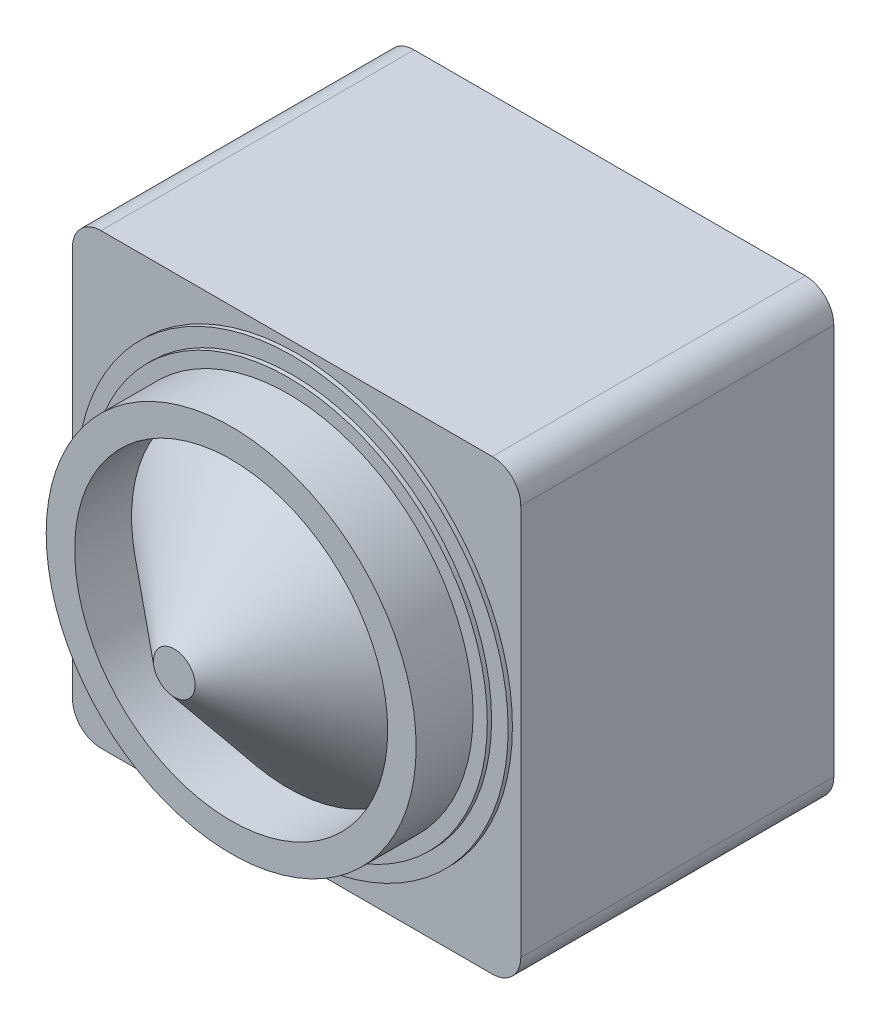
ISO-10303-21;
HEADER;
FILE_DESCRIPTION(('STEP AP214'),'2;1');
FILE_NAME('part.step','',(''),(''),'','','');
FILE_SCHEMA(('AUTOMOTIVE_DESIGN { 1 0 10303 214 1 1 1 1 }'));
ENDSEC;
DATA;
#1=APPLICATION_CONTEXT('core data for automotive mechanical design processes');
#2=APPLICATION_PROTOCOL_DEFINITION('international standard','automotive_design',2000,#1);
#3=PRODUCT_CONTEXT('',#1,'mechanical');
#4=PRODUCT('Part','Part','',(#3));
#5=PRODUCT_RELATED_PRODUCT_CATEGORY('part','',(#4));
#6=PRODUCT_DEFINITION_FORMATION('','',#4);
#7=PRODUCT_DEFINITION_CONTEXT('part definition',#1,'design');
#8=PRODUCT_DEFINITION('design','',#6,#7);
#9=PRODUCT_DEFINITION_SHAPE('','',#8);
#10=(LENGTH_UNIT() NAMED_UNIT(*) SI_UNIT(.MILLI.,.METRE.));
#11=(NAMED_UNIT(*) PLANE_ANGLE_UNIT() SI_UNIT($,.RADIAN.));
#12=(NAMED_UNIT(*) SI_UNIT($,.STERADIAN.) SOLID_ANGLE_UNIT());
#13=UNCERTAINTY_MEASURE_WITH_UNIT(LENGTH_MEASURE(1.E-05),#10,'distance_accuracy_value','');
#14=(GEOMETRIC_REPRESENTATION_CONTEXT(3) GLOBAL_UNCERTAINTY_ASSIGNED_CONTEXT((#13)) GLOBAL_UNIT_ASSIGNED_CONTEXT((#10,
#11,#12)) REPRESENTATION_CONTEXT('',''));
#15=CARTESIAN_POINT('',(0.,0.,0.));
#16=DIRECTION('',(0.,0.,1.));
#17=DIRECTION('',(1.,0.,0.));
#18=AXIS2_PLACEMENT_3D('',#15,#16,#17);
#19=CARTESIAN_POINT('',(0.,0.,0.));
#20=DIRECTION('',(0.,0.,1.));
#21=DIRECTION('',(1.,0.,0.));
#22=AXIS2_PLACEMENT_3D('',#19,#20,#21);
#23=PLANE('',#22);
#24=DIRECTION('',(1.,0.,0.));
#25=VECTOR('',#24,1.);
#26=CARTESIAN_POINT('',(0.,0.,0.));
#27=LINE('',#26,#25);
#28=CARTESIAN_POINT('',(2.,0.,0.));
#29=VERTEX_POINT('',#28);
#30=CARTESIAN_POINT('',(29.5,0.,0.));
#31=VERTEX_POINT('',#30);
#32=EDGE_CURVE('E158',#29,#31,#27,.T.);
#33=ORIENTED_EDGE('',*,*,#32,.F.);
#34=CARTESIAN_POINT('',(2.,2.,0.));
#35=DIRECTION('',(0.,0.,1.));
#36=DIRECTION('',(1.,0.,0.));
#37=AXIS2_PLACEMENT_3D('',#34,#35,#36);
#38=CIRCLE('',#37,2.);
#39=CARTESIAN_POINT('',(0.,2.,0.));
#40=VERTEX_POINT('',#39);
#41=EDGE_CURVE('E140',#29,#40,#38,.F.);
#42=ORIENTED_EDGE('',*,*,#41,.T.);
#43=DIRECTION('',(0.,1.,0.));
#44=VECTOR('',#43,1.);
#45=CARTESIAN_POINT('',(0.,0.,0.));
#46=LINE('',#45,#44);
#47=CARTESIAN_POINT('',(0.,29.5,0.));
#48=VERTEX_POINT('',#47);
#49=EDGE_CURVE('E186',#40,#48,#46,.T.);
#50=ORIENTED_EDGE('',*,*,#49,.T.);
#51=CARTESIAN_POINT('',(2.,29.5,0.));
#52=DIRECTION('',(0.,0.,1.));
#53=DIRECTION('',(1.,0.,0.));
#54=AXIS2_PLACEMENT_3D('',#51,#52,#53);
#55=CIRCLE('',#54,2.);
#56=CARTESIAN_POINT('',(2.,31.5,0.));
#57=VERTEX_POINT('',#56);
#58=EDGE_CURVE('E193',#48,#57,#55,.F.);
#59=ORIENTED_EDGE('',*,*,#58,.T.);
#60=DIRECTION('',(1.,0.,0.));
#61=VECTOR('',#60,1.);
#62=CARTESIAN_POINT('',(0.,31.5,0.));
#63=LINE('',#62,#61);
#64=CARTESIAN_POINT('',(29.5,31.5,0.));
#65=VERTEX_POINT('',#64);
#66=EDGE_CURVE('E174',#57,#65,#63,.T.);
#67=ORIENTED_EDGE('',*,*,#66,.T.);
#68=CARTESIAN_POINT('',(29.5,29.5,0.));
#69=DIRECTION('',(0.,0.,1.));
#70=DIRECTION('',(1.,0.,0.));
#71=AXIS2_PLACEMENT_3D('',#68,#69,#70);
#72=CIRCLE('',#71,2.);
#73=CARTESIAN_POINT('',(31.5,29.5,0.));
#74=VERTEX_POINT('',#73);
#75=EDGE_CURVE('E163',#65,#74,#72,.F.);
#76=ORIENTED_EDGE('',*,*,#75,.T.);
#77=DIRECTION('',(0.,1.,0.));
#78=VECTOR('',#77,1.);
#79=CARTESIAN_POINT('',(31.5,0.,0.));
#80=LINE('',#79,#78);
#81=CARTESIAN_POINT('',(31.5,2.,0.));
#82=VERTEX_POINT('',#81);
#83=EDGE_CURVE('E168',#82,#74,#80,.T.);
#84=ORIENTED_EDGE('',*,*,#83,.F.);
#85=CARTESIAN_POINT('',(29.5,2.,0.));
#86=DIRECTION('',(0.,0.,1.));
#87=DIRECTION('',(1.,0.,0.));
#88=AXIS2_PLACEMENT_3D('',#85,#86,#87);
#89=CIRCLE('',#88,2.);
#90=EDGE_CURVE('E152',#82,#31,#89,.F.);
#91=ORIENTED_EDGE('',*,*,#90,.T.);
#92=EDGE_LOOP('',(#33,#42,#50,#59,#67,#76,#84,#91));
#93=FACE_BOUND('',#92,.T.);
#94=ADVANCED_FACE('F71',(#93),#23,.F.);
#95=CARTESIAN_POINT('',(31.5,0.,22.));
#96=DIRECTION('',(-1.,0.,0.));
#97=DIRECTION('',(0.,0.,1.));
#98=AXIS2_PLACEMENT_3D('',#95,#96,#97);
#99=PLANE('',#98);
#100=DIRECTION('',(0.,1.,0.));
#101=VECTOR('',#100,1.);
#102=CARTESIAN_POINT('',(31.5,0.,22.));
#103=LINE('',#102,#101);
#104=CARTESIAN_POINT('',(31.5,2.,22.));
#105=VERTEX_POINT('',#104);
#106=CARTESIAN_POINT('',(31.5,29.5,22.));
#107=VERTEX_POINT('',#106);
#108=EDGE_CURVE('E233',#105,#107,#103,.T.);
#109=ORIENTED_EDGE('',*,*,#108,.F.);
#110=DIRECTION('',(0.,0.,-1.));
#111=VECTOR('',#110,1.);
#112=CARTESIAN_POINT('',(31.5,2.,22.));
#113=LINE('',#112,#111);
#114=EDGE_CURVE('E217',#105,#82,#113,.T.);
#115=ORIENTED_EDGE('',*,*,#114,.T.);
#116=ORIENTED_EDGE('',*,*,#83,.T.);
#117=DIRECTION('',(0.,0.,-1.));
#118=VECTOR('',#117,1.);
#119=CARTESIAN_POINT('',(31.5,29.5,22.));
#120=LINE('',#119,#118);
#121=EDGE_CURVE('E214',#74,#107,#120,.F.);
#122=ORIENTED_EDGE('',*,*,#121,.T.);
#123=EDGE_LOOP('',(#109,#115,#116,#122));
#124=FACE_BOUND('',#123,.T.);
#125=ADVANCED_FACE('F258',(#124),#99,.F.);
#126=CARTESIAN_POINT('',(0.,0.,22.));
#127=DIRECTION('',(0.,1.,0.));
#128=DIRECTION('',(0.,0.,1.));
#129=AXIS2_PLACEMENT_3D('',#126,#127,#128);
#130=PLANE('',#129);
#131=DIRECTION('',(1.,0.,0.));
#132=VECTOR('',#131,1.);
#133=CARTESIAN_POINT('',(0.,0.,22.));
#134=LINE('',#133,#132);
#135=CARTESIAN_POINT('',(2.,0.,22.));
#136=VERTEX_POINT('',#135);
#137=CARTESIAN_POINT('',(29.5,0.,22.));
#138=VERTEX_POINT('',#137);
#139=EDGE_CURVE('E161',#136,#138,#134,.T.);
#140=ORIENTED_EDGE('',*,*,#139,.F.);
#141=DIRECTION('',(0.,0.,-1.));
#142=VECTOR('',#141,1.);
#143=CARTESIAN_POINT('',(2.,0.,0.));
#144=LINE('',#143,#142);
#145=EDGE_CURVE('E144',#136,#29,#144,.T.);
#146=ORIENTED_EDGE('',*,*,#145,.T.);
#147=ORIENTED_EDGE('',*,*,#32,.T.);
#148=DIRECTION('',(0.,0.,-1.));
#149=VECTOR('',#148,1.);
#150=CARTESIAN_POINT('',(29.5,0.,22.));
#151=LINE('',#150,#149);
#152=EDGE_CURVE('E164',#31,#138,#151,.F.);
#153=ORIENTED_EDGE('',*,*,#152,.T.);
#154=EDGE_LOOP('',(#140,#146,#147,#153));
#155=FACE_BOUND('',#154,.T.);
#156=ADVANCED_FACE('F157',(#155),#130,.F.);
#157=CARTESIAN_POINT('',(0.,0.,22.));
#158=DIRECTION('',(-1.,0.,0.));
#159=DIRECTION('',(0.,0.,1.));
#160=AXIS2_PLACEMENT_3D('',#157,#158,#159);
#161=PLANE('',#160);
#162=ORIENTED_EDGE('',*,*,#49,.F.);
#163=DIRECTION('',(0.,0.,-1.));
#164=VECTOR('',#163,1.);
#165=CARTESIAN_POINT('',(0.,2.,22.));
#166=LINE('',#165,#164);
#167=CARTESIAN_POINT('',(0.,2.,22.));
#168=VERTEX_POINT('',#167);
#169=EDGE_CURVE('E145',#40,#168,#166,.F.);
#170=ORIENTED_EDGE('',*,*,#169,.T.);
#171=DIRECTION('',(0.,1.,0.));
#172=VECTOR('',#171,1.);
#173=CARTESIAN_POINT('',(0.,0.,22.));
#174=LINE('',#173,#172);
#175=CARTESIAN_POINT('',(0.,29.5,22.));
#176=VERTEX_POINT('',#175);
#177=EDGE_CURVE('E180',#168,#176,#174,.T.);
#178=ORIENTED_EDGE('',*,*,#177,.T.);
#179=DIRECTION('',(0.,0.,-1.));
#180=VECTOR('',#179,1.);
#181=CARTESIAN_POINT('',(0.,29.5,22.));
#182=LINE('',#181,#180);
#183=EDGE_CURVE('E151',#176,#48,#182,.T.);
#184=ORIENTED_EDGE('',*,*,#183,.T.);
#185=EDGE_LOOP('',(#162,#170,#178,#184));
#186=FACE_BOUND('',#185,.T.);
#187=ADVANCED_FACE('F242',(#186),#161,.T.);
#188=CARTESIAN_POINT('',(0.,31.5,22.));
#189=DIRECTION('',(0.,1.,0.));
#190=DIRECTION('',(0.,0.,1.));
#191=AXIS2_PLACEMENT_3D('',#188,#189,#190);
#192=PLANE('',#191);
#193=ORIENTED_EDGE('',*,*,#66,.F.);
#194=DIRECTION('',(0.,0.,-1.));
#195=VECTOR('',#194,1.);
#196=CARTESIAN_POINT('',(2.,31.5,22.));
#197=LINE('',#196,#195);
#198=CARTESIAN_POINT('',(2.,31.5,22.));
#199=VERTEX_POINT('',#198);
#200=EDGE_CURVE('E75',#57,#199,#197,.F.);
#201=ORIENTED_EDGE('',*,*,#200,.T.);
#202=DIRECTION('',(1.,0.,0.));
#203=VECTOR('',#202,1.);
#204=CARTESIAN_POINT('',(0.,31.5,22.));
#205=LINE('',#204,#203);
#206=CARTESIAN_POINT('',(29.5,31.5,22.));
#207=VERTEX_POINT('',#206);
#208=EDGE_CURVE('E235',#199,#207,#205,.T.);
#209=ORIENTED_EDGE('',*,*,#208,.T.);
#210=DIRECTION('',(0.,0.,-1.));
#211=VECTOR('',#210,1.);
#212=CARTESIAN_POINT('',(29.5,31.5,0.));
#213=LINE('',#212,#211);
#214=EDGE_CURVE('E220',#207,#65,#213,.T.);
#215=ORIENTED_EDGE('',*,*,#214,.T.);
#216=EDGE_LOOP('',(#193,#201,#209,#215));
#217=FACE_BOUND('',#216,.T.);
#218=ADVANCED_FACE('F246',(#217),#192,.T.);
#219=CARTESIAN_POINT('',(0.,0.,22.));
#220=DIRECTION('',(0.,0.,1.));
#221=DIRECTION('',(1.,0.,0.));
#222=AXIS2_PLACEMENT_3D('',#219,#220,#221);
#223=PLANE('',#222);
#224=CARTESIAN_POINT('',(15.75,15.75,22.));
#225=DIRECTION('',(0.,0.,1.));
#226=DIRECTION('',(1.,0.,0.));
#227=AXIS2_PLACEMENT_3D('',#224,#225,#226);
#228=CIRCLE('',#227,15.1642135623731);
#229=CARTESIAN_POINT('',(30.9142135623731,15.75,22.));
#230=VERTEX_POINT('',#229);
#231=EDGE_CURVE('E81',#230,#230,#228,.T.);
#232=ORIENTED_EDGE('',*,*,#231,.F.);
#233=EDGE_LOOP('',(#232));
#234=FACE_BOUND('',#233,.T.);
#235=ORIENTED_EDGE('',*,*,#177,.F.);
#236=CARTESIAN_POINT('',(2.,2.,22.));
#237=DIRECTION('',(0.,0.,1.));
#238=DIRECTION('',(1.,0.,0.));
#239=AXIS2_PLACEMENT_3D('',#236,#237,#238);
#240=CIRCLE('',#239,2.);
#241=EDGE_CURVE('E211',#168,#136,#240,.T.);
#242=ORIENTED_EDGE('',*,*,#241,.T.);
#243=ORIENTED_EDGE('',*,*,#139,.T.);
#244=CARTESIAN_POINT('',(29.5,2.,22.));
#245=DIRECTION('',(0.,0.,1.));
#246=DIRECTION('',(1.,0.,0.));
#247=AXIS2_PLACEMENT_3D('',#244,#245,#246);
#248=CIRCLE('',#247,2.);
#249=EDGE_CURVE('E208',#138,#105,#248,.T.);
#250=ORIENTED_EDGE('',*,*,#249,.T.);
#251=ORIENTED_EDGE('',*,*,#108,.T.);
#252=CARTESIAN_POINT('',(29.5,29.5,22.));
#253=DIRECTION('',(0.,0.,1.));
#254=DIRECTION('',(1.,0.,0.));
#255=AXIS2_PLACEMENT_3D('',#252,#253,#254);
#256=CIRCLE('',#255,2.);
#257=EDGE_CURVE('E89',#107,#207,#256,.T.);
#258=ORIENTED_EDGE('',*,*,#257,.T.);
#259=ORIENTED_EDGE('',*,*,#208,.F.);
#260=CARTESIAN_POINT('',(2.,29.5,22.));
#261=DIRECTION('',(0.,0.,1.));
#262=DIRECTION('',(1.,0.,0.));
#263=AXIS2_PLACEMENT_3D('',#260,#261,#262);
#264=CIRCLE('',#263,2.);
#265=EDGE_CURVE('E205',#199,#176,#264,.T.);
#266=ORIENTED_EDGE('',*,*,#265,.T.);
#267=EDGE_LOOP('',(#235,#242,#243,#250,#251,#258,#259,#266));
#268=FACE_BOUND('',#267,.T.);
#269=ADVANCED_FACE('F248',(#234,#268),#223,.T.);
#270=CARTESIAN_POINT('',(2.,2.,22.));
#271=DIRECTION('',(0.,0.,1.));
#272=DIRECTION('',(1.,0.,0.));
#273=AXIS2_PLACEMENT_3D('',#270,#271,#272);
#274=CYLINDRICAL_SURFACE('',#273,2.);
#275=ORIENTED_EDGE('',*,*,#241,.F.);
#276=ORIENTED_EDGE('',*,*,#169,.F.);
#277=ORIENTED_EDGE('',*,*,#41,.F.);
#278=ORIENTED_EDGE('',*,*,#145,.F.);
#279=EDGE_LOOP('',(#275,#276,#277,#278));
#280=FACE_BOUND('',#279,.T.);
#281=ADVANCED_FACE('F143',(#280),#274,.T.);
#282=CARTESIAN_POINT('',(29.5,2.,22.));
#283=DIRECTION('',(0.,0.,-1.));
#284=DIRECTION('',(-1.,0.,0.));
#285=AXIS2_PLACEMENT_3D('',#282,#283,#284);
#286=CYLINDRICAL_SURFACE('',#285,2.);
#287=ORIENTED_EDGE('',*,*,#249,.F.);
#288=ORIENTED_EDGE('',*,*,#152,.F.);
#289=ORIENTED_EDGE('',*,*,#90,.F.);
#290=ORIENTED_EDGE('',*,*,#114,.F.);
#291=EDGE_LOOP('',(#287,#288,#289,#290));
#292=FACE_BOUND('',#291,.T.);
#293=ADVANCED_FACE('F271',(#292),#286,.T.);
#294=CARTESIAN_POINT('',(2.,29.5,22.));
#295=DIRECTION('',(0.,0.,-1.));
#296=DIRECTION('',(-1.,0.,0.));
#297=AXIS2_PLACEMENT_3D('',#294,#295,#296);
#298=CYLINDRICAL_SURFACE('',#297,2.);
#299=ORIENTED_EDGE('',*,*,#265,.F.);
#300=ORIENTED_EDGE('',*,*,#200,.F.);
#301=ORIENTED_EDGE('',*,*,#58,.F.);
#302=ORIENTED_EDGE('',*,*,#183,.F.);
#303=EDGE_LOOP('',(#299,#300,#301,#302));
#304=FACE_BOUND('',#303,.T.);
#305=ADVANCED_FACE('F245',(#304),#298,.T.);
#306=CARTESIAN_POINT('',(29.5,29.5,22.));
#307=DIRECTION('',(0.,0.,1.));
#308=DIRECTION('',(1.,0.,0.));
#309=AXIS2_PLACEMENT_3D('',#306,#307,#308);
#310=CYLINDRICAL_SURFACE('',#309,2.);
#311=ORIENTED_EDGE('',*,*,#257,.F.);
#312=ORIENTED_EDGE('',*,*,#121,.F.);
#313=ORIENTED_EDGE('',*,*,#75,.F.);
#314=ORIENTED_EDGE('',*,*,#214,.F.);
#315=EDGE_LOOP('',(#311,#312,#313,#314));
#316=FACE_BOUND('',#315,.T.);
#317=ADVANCED_FACE('F73',(#316),#310,.T.);
#318=CARTESIAN_POINT('',(15.75,15.75,22.3));
#319=DIRECTION('',(0.,0.,-1.));
#320=DIRECTION('',(-1.,0.,0.));
#321=AXIS2_PLACEMENT_3D('',#318,#319,#320);
#322=CYLINDRICAL_SURFACE('',#321,15.1642135623731);
#323=CARTESIAN_POINT('',(15.75,15.75,22.3));
#324=DIRECTION('',(0.,0.,1.));
#325=DIRECTION('',(1.,0.,0.));
#326=AXIS2_PLACEMENT_3D('',#323,#324,#325);
#327=CIRCLE('',#326,15.1642135623731);
#328=CARTESIAN_POINT('',(30.9142135623731,15.75,22.3));
#329=VERTEX_POINT('',#328);
#330=EDGE_CURVE('E169',#329,#329,#327,.T.);
#331=ORIENTED_EDGE('',*,*,#330,.F.);
#332=EDGE_LOOP('',(#331));
#333=FACE_BOUND('',#332,.T.);
#334=ORIENTED_EDGE('',*,*,#231,.T.);
#335=EDGE_LOOP('',(#334));
#336=FACE_BOUND('',#335,.T.);
#337=ADVANCED_FACE('F278',(#333,#336),#322,.T.);
#338=CARTESIAN_POINT('',(15.75,15.75,22.3));
#339=DIRECTION('',(0.,0.,1.));
#340=DIRECTION('',(1.,0.,0.));
#341=AXIS2_PLACEMENT_3D('',#338,#339,#340);
#342=PLANE('',#341);
#343=CARTESIAN_POINT('',(15.75,15.75,22.3));
#344=DIRECTION('',(0.,0.,1.));
#345=DIRECTION('',(1.,0.,0.));
#346=AXIS2_PLACEMENT_3D('',#343,#344,#345);
#347=CIRCLE('',#346,14.);
#348=CARTESIAN_POINT('',(29.75,15.75,22.3));
#349=VERTEX_POINT('',#348);
#350=EDGE_CURVE('E12',#349,#349,#347,.T.);
#351=ORIENTED_EDGE('',*,*,#350,.F.);
#352=EDGE_LOOP('',(#351));
#353=FACE_BOUND('',#352,.T.);
#354=ORIENTED_EDGE('',*,*,#330,.T.);
#355=EDGE_LOOP('',(#354));
#356=FACE_BOUND('',#355,.T.);
#357=ADVANCED_FACE('F283',(#353,#356),#342,.T.);
#358=CARTESIAN_POINT('',(15.75,15.75,22.6));
#359=DIRECTION('',(0.,0.,-1.));
#360=DIRECTION('',(-1.,0.,0.));
#361=AXIS2_PLACEMENT_3D('',#358,#359,#360);
#362=CYLINDRICAL_SURFACE('',#361,14.);
#363=CARTESIAN_POINT('',(15.75,15.75,22.6));
#364=DIRECTION('',(0.,0.,1.));
#365=DIRECTION('',(1.,0.,0.));
#366=AXIS2_PLACEMENT_3D('',#363,#364,#365);
#367=CIRCLE('',#366,14.);
#368=CARTESIAN_POINT('',(29.75,15.75,22.6));
#369=VERTEX_POINT('',#368);
#370=EDGE_CURVE('E177',#369,#369,#367,.T.);
#371=ORIENTED_EDGE('',*,*,#370,.F.);
#372=EDGE_LOOP('',(#371));
#373=FACE_BOUND('',#372,.T.);
#374=ORIENTED_EDGE('',*,*,#350,.T.);
#375=EDGE_LOOP('',(#374));
#376=FACE_BOUND('',#375,.T.);
#377=ADVANCED_FACE('F292',(#373,#376),#362,.T.);
#378=CARTESIAN_POINT('',(15.75,15.75,22.6));
#379=DIRECTION('',(0.,0.,1.));
#380=DIRECTION('',(1.,0.,0.));
#381=AXIS2_PLACEMENT_3D('',#378,#379,#380);
#382=PLANE('',#381);
#383=CARTESIAN_POINT('',(15.75,15.75,22.6));
#384=DIRECTION('',(0.,0.,1.));
#385=DIRECTION('',(1.,0.,0.));
#386=AXIS2_PLACEMENT_3D('',#383,#384,#385);
#387=CIRCLE('',#386,13.);
#388=CARTESIAN_POINT('',(28.75,15.75,22.6));
#389=VERTEX_POINT('',#388);
#390=EDGE_CURVE('E335',#389,#389,#387,.T.);
#391=ORIENTED_EDGE('',*,*,#390,.F.);
#392=EDGE_LOOP('',(#391));
#393=FACE_BOUND('',#392,.T.);
#394=ORIENTED_EDGE('',*,*,#370,.T.);
#395=EDGE_LOOP('',(#394));
#396=FACE_BOUND('',#395,.T.);
#397=ADVANCED_FACE('F299',(#393,#396),#382,.T.);
#398=CARTESIAN_POINT('',(15.75,15.75,26.6));
#399=DIRECTION('',(0.,0.,1.));
#400=DIRECTION('',(1.,0.,0.));
#401=AXIS2_PLACEMENT_3D('',#398,#399,#400);
#402=PLANE('',#401);
#403=CARTESIAN_POINT('',(15.75,15.75,26.6));
#404=DIRECTION('',(0.,0.,1.));
#405=DIRECTION('',(1.,0.,0.));
#406=AXIS2_PLACEMENT_3D('',#403,#404,#405);
#407=CIRCLE('',#406,13.);
#408=CARTESIAN_POINT('',(28.75,15.75,26.6));
#409=VERTEX_POINT('',#408);
#410=EDGE_CURVE('E340',#409,#409,#407,.T.);
#411=ORIENTED_EDGE('',*,*,#410,.T.);
#412=EDGE_LOOP('',(#411));
#413=FACE_BOUND('',#412,.T.);
#414=CARTESIAN_POINT('',(15.75,15.75,26.6));
#415=DIRECTION('',(0.,0.,1.));
#416=DIRECTION('',(1.,0.,0.));
#417=AXIS2_PLACEMENT_3D('',#414,#415,#416);
#418=CIRCLE('',#417,11.);
#419=CARTESIAN_POINT('',(26.75,15.75,26.6));
#420=VERTEX_POINT('',#419);
#421=EDGE_CURVE('E329',#420,#420,#418,.T.);
#422=ORIENTED_EDGE('',*,*,#421,.F.);
#423=EDGE_LOOP('',(#422));
#424=FACE_BOUND('',#423,.T.);
#425=ADVANCED_FACE('F303',(#413,#424),#402,.T.);
#426=CARTESIAN_POINT('',(15.75,15.75,26.6));
#427=DIRECTION('',(0.,0.,-1.));
#428=DIRECTION('',(-1.,0.,0.));
#429=AXIS2_PLACEMENT_3D('',#426,#427,#428);
#430=CYLINDRICAL_SURFACE('',#429,13.);
#431=ORIENTED_EDGE('',*,*,#410,.F.);
#432=EDGE_LOOP('',(#431));
#433=FACE_BOUND('',#432,.T.);
#434=ORIENTED_EDGE('',*,*,#390,.T.);
#435=EDGE_LOOP('',(#434));
#436=FACE_BOUND('',#435,.T.);
#437=ADVANCED_FACE('F305',(#433,#436),#430,.T.);
#438=CARTESIAN_POINT('',(15.75,15.75,26.6));
#439=DIRECTION('',(0.,0.,-1.));
#440=DIRECTION('',(-1.,0.,0.));
#441=AXIS2_PLACEMENT_3D('',#438,#439,#440);
#442=CYLINDRICAL_SURFACE('',#441,11.);
#443=ORIENTED_EDGE('',*,*,#421,.T.);
#444=EDGE_LOOP('',(#443));
#445=FACE_BOUND('',#444,.T.);
#446=CARTESIAN_POINT('',(15.75,15.75,22.6));
#447=DIRECTION('',(0.,0.,1.));
#448=DIRECTION('',(1.,0.,0.));
#449=AXIS2_PLACEMENT_3D('',#446,#447,#448);
#450=CIRCLE('',#449,11.);
#451=CARTESIAN_POINT('',(26.75,15.75,22.6));
#452=VERTEX_POINT('',#451);
#453=EDGE_CURVE('E330',#452,#452,#450,.T.);
#454=ORIENTED_EDGE('',*,*,#453,.F.);
#455=EDGE_LOOP('',(#454));
#456=FACE_BOUND('',#455,.T.);
#457=ADVANCED_FACE('F308',(#445,#456),#442,.F.);
#458=CARTESIAN_POINT('',(15.75,15.75,22.6));
#459=DIRECTION('',(0.,0.,-1.));
#460=DIRECTION('',(1.,0.,0.));
#461=AXIS2_PLACEMENT_3D('',#458,#459,#460);
#462=CONICAL_SURFACE('',#461,11.,0.872664625997167);
#463=CARTESIAN_POINT('',(15.75,15.75,30.6));
#464=DIRECTION('',(0.,0.,1.));
#465=DIRECTION('',(1.,0.,0.));
#466=AXIS2_PLACEMENT_3D('',#463,#464,#465);
#467=CIRCLE('',#466,1.46597125924628);
#468=CARTESIAN_POINT('',(17.2159712592463,15.75,30.6));
#469=VERTEX_POINT('',#468);
#470=EDGE_CURVE('E327',#469,#469,#467,.T.);
#471=CARTESIAN_POINT('',(17.2159712592463,15.75,30.6));
#472=CARTESIAN_POINT('',(17.3152840586291,15.75,30.5166666666667));
#473=CARTESIAN_POINT('',(17.414596858012,15.75,30.4333333333333));
#474=CARTESIAN_POINT('',(17.6132224567777,15.75,30.2666666666667));
#475=CARTESIAN_POINT('',(17.7125352561605,15.75,30.1833333333333));
#476=CARTESIAN_POINT('',(17.9111608549262,15.75,30.0166666666667));
#477=CARTESIAN_POINT('',(18.0104736543091,15.75,29.9333333333333));
#478=CARTESIAN_POINT('',(18.2090992530748,15.75,29.7666666666667));
#479=CARTESIAN_POINT('',(18.3084120524576,15.75,29.6833333333333));
#480=CARTESIAN_POINT('',(18.5070376512234,15.75,29.5166666666667));
#481=CARTESIAN_POINT('',(18.6063504506062,15.75,29.4333333333333));
#482=CARTESIAN_POINT('',(18.8049760493719,15.75,29.2666666666667));
#483=CARTESIAN_POINT('',(18.9042888487548,15.75,29.1833333333333));
#484=CARTESIAN_POINT('',(19.1029144475205,15.75,29.0166666666667));
#485=CARTESIAN_POINT('',(19.2022272469033,15.75,28.9333333333333));
#486=CARTESIAN_POINT('',(19.400852845669,15.75,28.7666666666667));
#487=CARTESIAN_POINT('',(19.5001656450519,15.75,28.6833333333333));
#488=CARTESIAN_POINT('',(19.6987912438176,15.75,28.5166666666667));
#489=CARTESIAN_POINT('',(19.7981040432004,15.75,28.4333333333333));
#490=CARTESIAN_POINT('',(19.9967296419661,15.75,28.2666666666667));
#491=CARTESIAN_POINT('',(20.096042441349,15.75,28.1833333333333));
#492=CARTESIAN_POINT('',(20.2946680401147,15.75,28.0166666666667));
#493=CARTESIAN_POINT('',(20.3939808394975,15.75,27.9333333333333));
#494=CARTESIAN_POINT('',(20.5926064382632,15.75,27.7666666666667));
#495=CARTESIAN_POINT('',(20.6919192376461,15.75,27.6833333333333));
#496=CARTESIAN_POINT('',(20.8905448364118,15.75,27.5166666666667));
#497=CARTESIAN_POINT('',(20.9898576357946,15.75,27.4333333333333));
#498=CARTESIAN_POINT('',(21.1884832345603,15.75,27.2666666666667));
#499=CARTESIAN_POINT('',(21.2877960339432,15.75,27.1833333333333));
#500=CARTESIAN_POINT('',(21.4864216327089,15.75,27.0166666666667));
#501=CARTESIAN_POINT('',(21.5857344320917,15.75,26.9333333333333));
#502=CARTESIAN_POINT('',(21.7843600308574,15.75,26.7666666666667));
#503=CARTESIAN_POINT('',(21.8836728302403,15.75,26.6833333333333));
#504=CARTESIAN_POINT('',(22.082298429006,15.75,26.5166666666667));
#505=CARTESIAN_POINT('',(22.1816112283888,15.75,26.4333333333333));
#506=CARTESIAN_POINT('',(22.3802368271546,15.75,26.2666666666667));
#507=CARTESIAN_POINT('',(22.4795496265374,15.75,26.1833333333333));
#508=CARTESIAN_POINT('',(22.6781752253031,15.75,26.0166666666667));
#509=CARTESIAN_POINT('',(22.777488024686,15.75,25.9333333333333));
#510=CARTESIAN_POINT('',(22.9761136234517,15.75,25.7666666666667));
#511=CARTESIAN_POINT('',(23.0754264228345,15.75,25.6833333333333));
#512=CARTESIAN_POINT('',(23.2740520216002,15.75,25.5166666666667));
#513=CARTESIAN_POINT('',(23.3733648209831,15.75,25.4333333333333));
#514=CARTESIAN_POINT('',(23.5719904197488,15.75,25.2666666666667));
#515=CARTESIAN_POINT('',(23.6713032191316,15.75,25.1833333333333));
#516=CARTESIAN_POINT('',(23.8699288178973,15.75,25.0166666666667));
#517=CARTESIAN_POINT('',(23.9692416172802,15.75,24.9333333333333));
#518=CARTESIAN_POINT('',(24.1678672160459,15.75,24.7666666666667));
#519=CARTESIAN_POINT('',(24.2671800154287,15.75,24.6833333333333));
#520=CARTESIAN_POINT('',(24.4658056141944,15.75,24.5166666666667));
#521=CARTESIAN_POINT('',(24.5651184135773,15.75,24.4333333333333));
#522=CARTESIAN_POINT('',(24.763744012343,15.75,24.2666666666667));
#523=CARTESIAN_POINT('',(24.8630568117258,15.75,24.1833333333333));
#524=CARTESIAN_POINT('',(25.0616824104915,15.75,24.0166666666667));
#525=CARTESIAN_POINT('',(25.1609952098744,15.75,23.9333333333333));
#526=CARTESIAN_POINT('',(25.3596208086401,15.75,23.7666666666667));
#527=CARTESIAN_POINT('',(25.4589336080229,15.75,23.6833333333333));
#528=CARTESIAN_POINT('',(25.6575592067886,15.75,23.5166666666667));
#529=CARTESIAN_POINT('',(25.7568720061715,15.75,23.4333333333333));
#530=CARTESIAN_POINT('',(25.9554976049372,15.75,23.2666666666667));
#531=CARTESIAN_POINT('',(26.05481040432,15.75,23.1833333333333));
#532=CARTESIAN_POINT('',(26.2534360030857,15.75,23.0166666666667));
#533=CARTESIAN_POINT('',(26.3527488024686,15.75,22.9333333333333));
#534=CARTESIAN_POINT('',(26.5513744012343,15.75,22.7666666666667));
#535=CARTESIAN_POINT('',(26.6506872006172,15.75,22.6833333333333));
#536=CARTESIAN_POINT('',(26.75,15.75,22.6));
#537=B_SPLINE_CURVE_WITH_KNOTS('',3,(#471,#472,#473,#474,#475,#476,#477,#478,#479,#480,#481,
#482,#483,#484,#485,#486,#487,#488,#489,#490,#491,#492,#493,#494,#495,#496,#497,#498,#499,#500,
#501,#502,#503,#504,#505,#506,#507,#508,#509,#510,#511,#512,#513,#514,#515,#516,#517,#518,#519,
#520,#521,#522,#523,#524,#525,#526,#527,#528,#529,#530,#531,#532,#533,#534,#535,#536),
.UNSPECIFIED.,.F.,.F.,(4,2,2,2,2,2,2,2,2,2,2,2,2,2,2,2,2,2,2,2,2,2,2,2,2,2,2,2,2,2,2,2,4),(0.,
0.388930956715104,0.777861913430208,1.16679287014531,1.55572382686042,1.94465478357552,
2.33358574029062,2.72251669700573,3.11144765372083,3.50037861043593,3.88930956715104,
4.27824052386614,4.66717148058124,5.05610243729635,5.44503339401146,5.83396435072656,
6.22289530744166,6.61182626415677,7.00075722087187,7.38968817758697,7.77861913430208,
8.16755009101718,8.55648104773228,8.94541200444739,9.33434296116249,9.7232739178776,
10.1122048745927,10.5011358313078,10.8900667880229,11.278997744738,11.6679287014531,
12.0568596581682,12.4457906148833),.UNSPECIFIED.);
#538=EDGE_CURVE('BSEAM315',#469,#452,#537,.T.);
#539=ORIENTED_EDGE('',*,*,#470,.F.);
#540=ORIENTED_EDGE('',*,*,#453,.T.);
#541=ORIENTED_EDGE('',*,*,#538,.T.);
#542=ORIENTED_EDGE('',*,*,#538,.F.);
#543=EDGE_LOOP('',(#539,#541,#540,#542));
#544=FACE_BOUND('',#543,.T.);
#545=ADVANCED_FACE('F315',(#544),#462,.T.);
#546=CARTESIAN_POINT('',(15.75,15.75,30.6));
#547=DIRECTION('',(0.,0.,1.));
#548=DIRECTION('',(1.,0.,0.));
#549=AXIS2_PLACEMENT_3D('',#546,#547,#548);
#550=PLANE('',#549);
#551=ORIENTED_EDGE('',*,*,#470,.T.);
#552=EDGE_LOOP('',(#551));
#553=FACE_BOUND('',#552,.T.);
#554=ADVANCED_FACE('F319',(#553),#550,.T.);
#555=CLOSED_SHELL('',(#94,#125,#156,#187,#218,#269,#281,#293,#305,#317,#337,#357,#377,#397,#425,
#437,#457,#545,#554));
#556=MANIFOLD_SOLID_BREP('B2',#555);
#557=ADVANCED_BREP_SHAPE_REPRESENTATION('',(#18,#556),#14);
#558=SHAPE_DEFINITION_REPRESENTATION(#9,#557);
ENDSEC;
END-ISO-10303-21;
